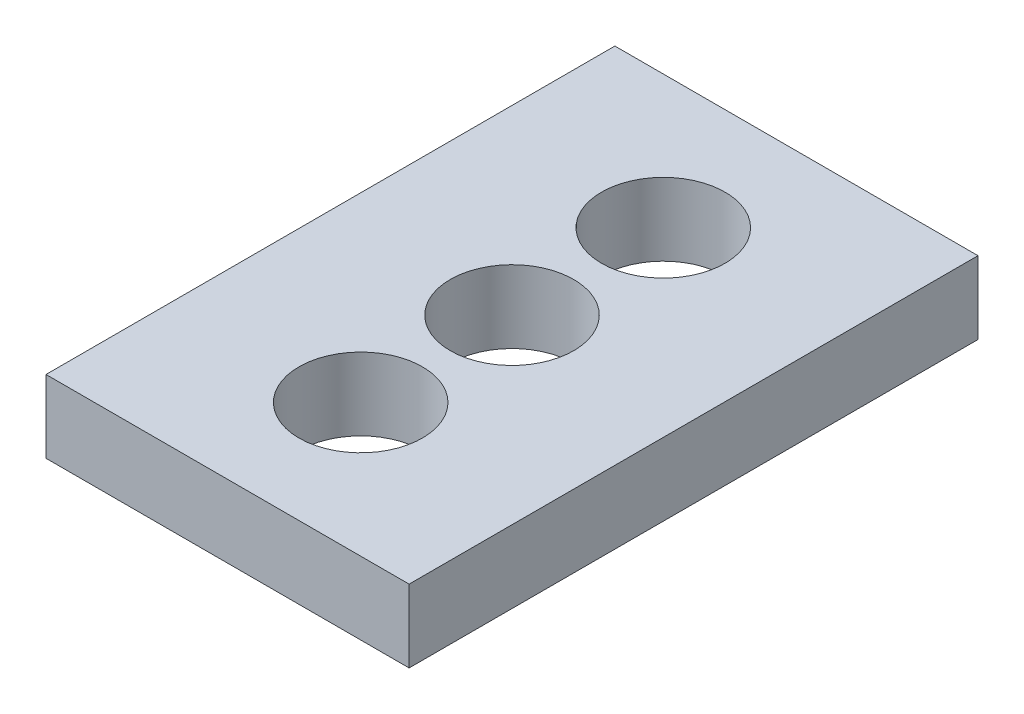
ISO-10303-21;
HEADER;
FILE_DESCRIPTION(('STEP AP214'),'2;1');
FILE_NAME('part.step','',(''),(''),'','','');
FILE_SCHEMA(('AUTOMOTIVE_DESIGN { 1 0 10303 214 1 1 1 1 }'));
ENDSEC;
DATA;
#1=APPLICATION_CONTEXT('core data for automotive mechanical design processes');
#2=APPLICATION_PROTOCOL_DEFINITION('international standard','automotive_design',2000,#1);
#3=PRODUCT_CONTEXT('',#1,'mechanical');
#4=PRODUCT('Part','Part','',(#3));
#5=PRODUCT_RELATED_PRODUCT_CATEGORY('part','',(#4));
#6=PRODUCT_DEFINITION_FORMATION('','',#4);
#7=PRODUCT_DEFINITION_CONTEXT('part definition',#1,'design');
#8=PRODUCT_DEFINITION('design','',#6,#7);
#9=PRODUCT_DEFINITION_SHAPE('','',#8);
#10=(LENGTH_UNIT() NAMED_UNIT(*) SI_UNIT(.MILLI.,.METRE.));
#11=(NAMED_UNIT(*) PLANE_ANGLE_UNIT() SI_UNIT($,.RADIAN.));
#12=(NAMED_UNIT(*) SI_UNIT($,.STERADIAN.) SOLID_ANGLE_UNIT());
#13=UNCERTAINTY_MEASURE_WITH_UNIT(LENGTH_MEASURE(1.E-05),#10,'distance_accuracy_value','');
#14=(GEOMETRIC_REPRESENTATION_CONTEXT(3) GLOBAL_UNCERTAINTY_ASSIGNED_CONTEXT((#13)) GLOBAL_UNIT_ASSIGNED_CONTEXT((#10,
#11,#12)) REPRESENTATION_CONTEXT('',''));
#15=CARTESIAN_POINT('',(0.,0.,0.));
#16=DIRECTION('',(0.,0.,1.));
#17=DIRECTION('',(1.,0.,0.));
#18=AXIS2_PLACEMENT_3D('',#15,#16,#17);
#19=CARTESIAN_POINT('',(0.,3.,0.));
#20=DIRECTION('',(0.,-1.,0.));
#21=DIRECTION('',(0.,0.,-1.));
#22=AXIS2_PLACEMENT_3D('',#19,#20,#21);
#23=PLANE('',#22);
#24=DIRECTION('',(0.,0.,-1.));
#25=VECTOR('',#24,1.);
#26=CARTESIAN_POINT('',(-40.5969029398926,3.,15.6453966007226));
#27=LINE('',#26,#25);
#28=CARTESIAN_POINT('',(-40.5969029398926,3.,15.6453966007226));
#29=VERTEX_POINT('',#28);
#30=CARTESIAN_POINT('',(-40.5969029398926,3.,-7.85460339927737));
#31=VERTEX_POINT('',#30);
#32=EDGE_CURVE('E85',#29,#31,#27,.T.);
#33=ORIENTED_EDGE('',*,*,#32,.T.);
#34=DIRECTION('',(-1.,0.,0.));
#35=VECTOR('',#34,1.);
#36=CARTESIAN_POINT('',(-55.5969029398926,3.,-7.85460339927737));
#37=LINE('',#36,#35);
#38=CARTESIAN_POINT('',(-55.5969029398926,3.,-7.85460339927737));
#39=VERTEX_POINT('',#38);
#40=EDGE_CURVE('E80',#31,#39,#37,.T.);
#41=ORIENTED_EDGE('',*,*,#40,.T.);
#42=DIRECTION('',(0.,0.,1.));
#43=VECTOR('',#42,1.);
#44=CARTESIAN_POINT('',(-55.5969029398926,3.,15.6453966007226));
#45=LINE('',#44,#43);
#46=CARTESIAN_POINT('',(-55.5969029398926,3.,15.6453966007226));
#47=VERTEX_POINT('',#46);
#48=EDGE_CURVE('E83',#39,#47,#45,.T.);
#49=ORIENTED_EDGE('',*,*,#48,.T.);
#50=DIRECTION('',(1.,0.,0.));
#51=VECTOR('',#50,1.);
#52=CARTESIAN_POINT('',(-55.5969029398926,3.,15.6453966007226));
#53=LINE('',#52,#51);
#54=EDGE_CURVE('E50',#47,#29,#53,.T.);
#55=ORIENTED_EDGE('',*,*,#54,.T.);
#56=EDGE_LOOP('',(#33,#41,#49,#55));
#57=FACE_BOUND('',#56,.T.);
#58=CARTESIAN_POINT('',(-48.0969029398926,3.,-2.35460339927737));
#59=DIRECTION('',(0.,1.,0.));
#60=DIRECTION('',(0.,0.,1.));
#61=AXIS2_PLACEMENT_3D('',#58,#59,#60);
#62=CIRCLE('',#61,2.55);
#63=CARTESIAN_POINT('',(-48.0969029398926,3.,0.195396600722632));
#64=VERTEX_POINT('',#63);
#65=EDGE_CURVE('E100',#64,#64,#62,.T.);
#66=ORIENTED_EDGE('',*,*,#65,.F.);
#67=EDGE_LOOP('',(#66));
#68=FACE_BOUND('',#67,.T.);
#69=CARTESIAN_POINT('',(-48.0969029398926,3.,3.89539660072263));
#70=DIRECTION('',(0.,1.,0.));
#71=DIRECTION('',(0.,0.,1.));
#72=AXIS2_PLACEMENT_3D('',#69,#70,#71);
#73=CIRCLE('',#72,2.55);
#74=CARTESIAN_POINT('',(-48.0969029398926,3.,6.44539660072263));
#75=VERTEX_POINT('',#74);
#76=EDGE_CURVE('E115',#75,#75,#73,.T.);
#77=ORIENTED_EDGE('',*,*,#76,.F.);
#78=EDGE_LOOP('',(#77));
#79=FACE_BOUND('',#78,.T.);
#80=CARTESIAN_POINT('',(-48.0969029398926,3.,10.1453966007226));
#81=DIRECTION('',(0.,1.,0.));
#82=DIRECTION('',(0.,0.,1.));
#83=AXIS2_PLACEMENT_3D('',#80,#81,#82);
#84=CIRCLE('',#83,2.55);
#85=CARTESIAN_POINT('',(-48.0969029398926,3.,12.6953966007226));
#86=VERTEX_POINT('',#85);
#87=EDGE_CURVE('E121',#86,#86,#84,.T.);
#88=ORIENTED_EDGE('',*,*,#87,.F.);
#89=EDGE_LOOP('',(#88));
#90=FACE_BOUND('',#89,.T.);
#91=ADVANCED_FACE('F33',(#57,#68,#79,#90),#23,.F.);
#92=CARTESIAN_POINT('',(0.,0.,0.));
#93=DIRECTION('',(0.,-1.,0.));
#94=DIRECTION('',(0.,0.,-1.));
#95=AXIS2_PLACEMENT_3D('',#92,#93,#94);
#96=PLANE('',#95);
#97=CARTESIAN_POINT('',(-48.0969029398926,0.,3.89539660072263));
#98=DIRECTION('',(0.,1.,0.));
#99=DIRECTION('',(0.,0.,1.));
#100=AXIS2_PLACEMENT_3D('',#97,#98,#99);
#101=CIRCLE('',#100,2.55);
#102=CARTESIAN_POINT('',(-48.0969029398926,0.,6.44539660072263));
#103=VERTEX_POINT('',#102);
#104=EDGE_CURVE('E118',#103,#103,#101,.T.);
#105=ORIENTED_EDGE('',*,*,#104,.T.);
#106=EDGE_LOOP('',(#105));
#107=FACE_BOUND('',#106,.T.);
#108=DIRECTION('',(0.,0.,-1.));
#109=VECTOR('',#108,1.);
#110=CARTESIAN_POINT('',(-40.5969029398926,0.,15.6453966007226));
#111=LINE('',#110,#109);
#112=CARTESIAN_POINT('',(-40.5969029398926,0.,15.6453966007226));
#113=VERTEX_POINT('',#112);
#114=CARTESIAN_POINT('',(-40.5969029398926,0.,-7.85460339927737));
#115=VERTEX_POINT('',#114);
#116=EDGE_CURVE('E97',#113,#115,#111,.T.);
#117=ORIENTED_EDGE('',*,*,#116,.F.);
#118=DIRECTION('',(1.,0.,0.));
#119=VECTOR('',#118,1.);
#120=CARTESIAN_POINT('',(-55.5969029398926,0.,15.6453966007226));
#121=LINE('',#120,#119);
#122=CARTESIAN_POINT('',(-55.5969029398926,0.,15.6453966007226));
#123=VERTEX_POINT('',#122);
#124=EDGE_CURVE('E73',#123,#113,#121,.T.);
#125=ORIENTED_EDGE('',*,*,#124,.F.);
#126=DIRECTION('',(0.,0.,1.));
#127=VECTOR('',#126,1.);
#128=CARTESIAN_POINT('',(-55.5969029398926,0.,15.6453966007226));
#129=LINE('',#128,#127);
#130=CARTESIAN_POINT('',(-55.5969029398926,0.,-7.85460339927737));
#131=VERTEX_POINT('',#130);
#132=EDGE_CURVE('E67',#131,#123,#129,.T.);
#133=ORIENTED_EDGE('',*,*,#132,.F.);
#134=DIRECTION('',(-1.,0.,0.));
#135=VECTOR('',#134,1.);
#136=CARTESIAN_POINT('',(-55.5969029398926,0.,-7.85460339927737));
#137=LINE('',#136,#135);
#138=EDGE_CURVE('E89',#115,#131,#137,.T.);
#139=ORIENTED_EDGE('',*,*,#138,.F.);
#140=EDGE_LOOP('',(#117,#125,#133,#139));
#141=FACE_BOUND('',#140,.T.);
#142=CARTESIAN_POINT('',(-48.0969029398926,0.,-2.35460339927737));
#143=DIRECTION('',(0.,1.,0.));
#144=DIRECTION('',(0.,0.,1.));
#145=AXIS2_PLACEMENT_3D('',#142,#143,#144);
#146=CIRCLE('',#145,2.55);
#147=CARTESIAN_POINT('',(-48.0969029398926,0.,0.195396600722632));
#148=VERTEX_POINT('',#147);
#149=EDGE_CURVE('E112',#148,#148,#146,.T.);
#150=ORIENTED_EDGE('',*,*,#149,.T.);
#151=EDGE_LOOP('',(#150));
#152=FACE_BOUND('',#151,.T.);
#153=CARTESIAN_POINT('',(-48.0969029398926,0.,10.1453966007226));
#154=DIRECTION('',(0.,1.,0.));
#155=DIRECTION('',(0.,0.,1.));
#156=AXIS2_PLACEMENT_3D('',#153,#154,#155);
#157=CIRCLE('',#156,2.55);
#158=CARTESIAN_POINT('',(-48.0969029398926,0.,12.6953966007226));
#159=VERTEX_POINT('',#158);
#160=EDGE_CURVE('E124',#159,#159,#157,.T.);
#161=ORIENTED_EDGE('',*,*,#160,.T.);
#162=EDGE_LOOP('',(#161));
#163=FACE_BOUND('',#162,.T.);
#164=ADVANCED_FACE('F108',(#107,#141,#152,#163),#96,.T.);
#165=CARTESIAN_POINT('',(-40.5969029398926,3.,15.6453966007226));
#166=DIRECTION('',(-1.,0.,0.));
#167=DIRECTION('',(0.,0.,1.));
#168=AXIS2_PLACEMENT_3D('',#165,#166,#167);
#169=PLANE('',#168);
#170=ORIENTED_EDGE('',*,*,#116,.T.);
#171=DIRECTION('',(0.,-1.,0.));
#172=VECTOR('',#171,1.);
#173=CARTESIAN_POINT('',(-40.5969029398926,3.,-7.85460339927737));
#174=LINE('',#173,#172);
#175=EDGE_CURVE('E11',#31,#115,#174,.T.);
#176=ORIENTED_EDGE('',*,*,#175,.F.);
#177=ORIENTED_EDGE('',*,*,#32,.F.);
#178=DIRECTION('',(0.,-1.,0.));
#179=VECTOR('',#178,1.);
#180=CARTESIAN_POINT('',(-40.5969029398926,3.,15.6453966007226));
#181=LINE('',#180,#179);
#182=EDGE_CURVE('E93',#29,#113,#181,.T.);
#183=ORIENTED_EDGE('',*,*,#182,.T.);
#184=EDGE_LOOP('',(#170,#176,#177,#183));
#185=FACE_BOUND('',#184,.T.);
#186=ADVANCED_FACE('F35',(#185),#169,.F.);
#187=CARTESIAN_POINT('',(-55.5969029398926,3.,-7.85460339927737));
#188=DIRECTION('',(0.,0.,1.));
#189=DIRECTION('',(1.,0.,0.));
#190=AXIS2_PLACEMENT_3D('',#187,#188,#189);
#191=PLANE('',#190);
#192=ORIENTED_EDGE('',*,*,#138,.T.);
#193=DIRECTION('',(0.,-1.,0.));
#194=VECTOR('',#193,1.);
#195=CARTESIAN_POINT('',(-55.5969029398926,3.,-7.85460339927737));
#196=LINE('',#195,#194);
#197=EDGE_CURVE('E42',#39,#131,#196,.T.);
#198=ORIENTED_EDGE('',*,*,#197,.F.);
#199=ORIENTED_EDGE('',*,*,#40,.F.);
#200=ORIENTED_EDGE('',*,*,#175,.T.);
#201=EDGE_LOOP('',(#192,#198,#199,#200));
#202=FACE_BOUND('',#201,.T.);
#203=ADVANCED_FACE('F88',(#202),#191,.F.);
#204=CARTESIAN_POINT('',(-55.5969029398926,3.,15.6453966007226));
#205=DIRECTION('',(1.,0.,0.));
#206=DIRECTION('',(0.,0.,-1.));
#207=AXIS2_PLACEMENT_3D('',#204,#205,#206);
#208=PLANE('',#207);
#209=ORIENTED_EDGE('',*,*,#132,.T.);
#210=DIRECTION('',(0.,-1.,0.));
#211=VECTOR('',#210,1.);
#212=CARTESIAN_POINT('',(-55.5969029398926,3.,15.6453966007226));
#213=LINE('',#212,#211);
#214=EDGE_CURVE('E90',#47,#123,#213,.T.);
#215=ORIENTED_EDGE('',*,*,#214,.F.);
#216=ORIENTED_EDGE('',*,*,#48,.F.);
#217=ORIENTED_EDGE('',*,*,#197,.T.);
#218=EDGE_LOOP('',(#209,#215,#216,#217));
#219=FACE_BOUND('',#218,.T.);
#220=ADVANCED_FACE('F91',(#219),#208,.F.);
#221=CARTESIAN_POINT('',(-55.5969029398926,3.,15.6453966007226));
#222=DIRECTION('',(0.,0.,-1.));
#223=DIRECTION('',(-1.,0.,0.));
#224=AXIS2_PLACEMENT_3D('',#221,#222,#223);
#225=PLANE('',#224);
#226=ORIENTED_EDGE('',*,*,#124,.T.);
#227=ORIENTED_EDGE('',*,*,#182,.F.);
#228=ORIENTED_EDGE('',*,*,#54,.F.);
#229=ORIENTED_EDGE('',*,*,#214,.T.);
#230=EDGE_LOOP('',(#226,#227,#228,#229));
#231=FACE_BOUND('',#230,.T.);
#232=ADVANCED_FACE('F105',(#231),#225,.F.);
#233=CARTESIAN_POINT('',(-48.0969029398926,3.,-2.35460339927737));
#234=DIRECTION('',(0.,-1.,0.));
#235=DIRECTION('',(0.,0.,-1.));
#236=AXIS2_PLACEMENT_3D('',#233,#234,#235);
#237=CYLINDRICAL_SURFACE('',#236,2.55);
#238=ORIENTED_EDGE('',*,*,#65,.T.);
#239=EDGE_LOOP('',(#238));
#240=FACE_BOUND('',#239,.T.);
#241=ORIENTED_EDGE('',*,*,#149,.F.);
#242=EDGE_LOOP('',(#241));
#243=FACE_BOUND('',#242,.T.);
#244=ADVANCED_FACE('F141',(#240,#243),#237,.F.);
#245=CARTESIAN_POINT('',(-48.0969029398926,3.,3.89539660072263));
#246=DIRECTION('',(0.,-1.,0.));
#247=DIRECTION('',(0.,0.,-1.));
#248=AXIS2_PLACEMENT_3D('',#245,#246,#247);
#249=CYLINDRICAL_SURFACE('',#248,2.55);
#250=ORIENTED_EDGE('',*,*,#76,.T.);
#251=EDGE_LOOP('',(#250));
#252=FACE_BOUND('',#251,.T.);
#253=ORIENTED_EDGE('',*,*,#104,.F.);
#254=EDGE_LOOP('',(#253));
#255=FACE_BOUND('',#254,.T.);
#256=ADVANCED_FACE('F187',(#252,#255),#249,.F.);
#257=CARTESIAN_POINT('',(-48.0969029398926,3.,10.1453966007226));
#258=DIRECTION('',(0.,-1.,0.));
#259=DIRECTION('',(0.,0.,-1.));
#260=AXIS2_PLACEMENT_3D('',#257,#258,#259);
#261=CYLINDRICAL_SURFACE('',#260,2.55);
#262=ORIENTED_EDGE('',*,*,#87,.T.);
#263=EDGE_LOOP('',(#262));
#264=FACE_BOUND('',#263,.T.);
#265=ORIENTED_EDGE('',*,*,#160,.F.);
#266=EDGE_LOOP('',(#265));
#267=FACE_BOUND('',#266,.T.);
#268=ADVANCED_FACE('F130',(#264,#267),#261,.F.);
#269=CLOSED_SHELL('',(#91,#164,#186,#203,#220,#232,#244,#256,#268));
#270=MANIFOLD_SOLID_BREP('B2',#269);
#271=ADVANCED_BREP_SHAPE_REPRESENTATION('',(#18,#270),#14);
#272=SHAPE_DEFINITION_REPRESENTATION(#9,#271);
ENDSEC;
END-ISO-10303-21;
